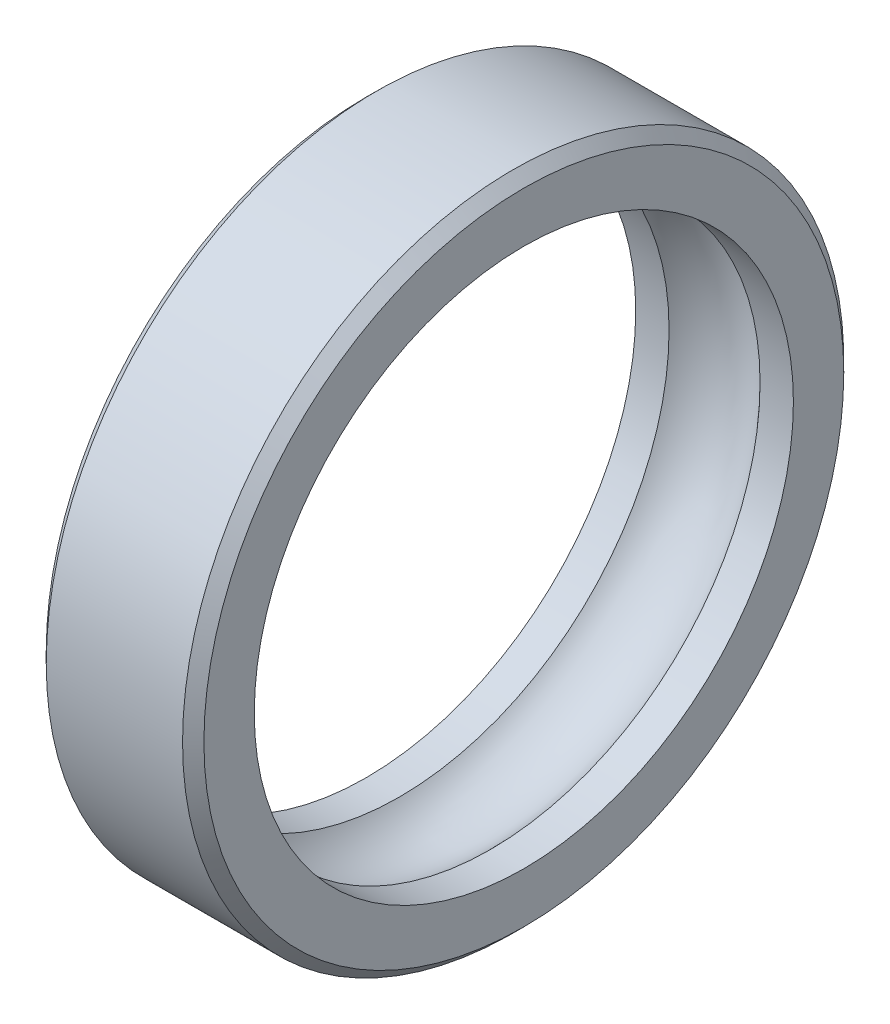
ISO-10303-21;
HEADER;
FILE_DESCRIPTION(('STEP AP214'),'2;1');
FILE_NAME('part.step','',(''),(''),'','','');
FILE_SCHEMA(('AUTOMOTIVE_DESIGN { 1 0 10303 214 1 1 1 1 }'));
ENDSEC;
DATA;
#1=APPLICATION_CONTEXT('core data for automotive mechanical design processes');
#2=APPLICATION_PROTOCOL_DEFINITION('international standard','automotive_design',2000,#1);
#3=PRODUCT_CONTEXT('',#1,'mechanical');
#4=PRODUCT('Part','Part','',(#3));
#5=PRODUCT_RELATED_PRODUCT_CATEGORY('part','',(#4));
#6=PRODUCT_DEFINITION_FORMATION('','',#4);
#7=PRODUCT_DEFINITION_CONTEXT('part definition',#1,'design');
#8=PRODUCT_DEFINITION('design','',#6,#7);
#9=PRODUCT_DEFINITION_SHAPE('','',#8);
#10=(LENGTH_UNIT() NAMED_UNIT(*) SI_UNIT(.MILLI.,.METRE.));
#11=(NAMED_UNIT(*) PLANE_ANGLE_UNIT() SI_UNIT($,.RADIAN.));
#12=(NAMED_UNIT(*) SI_UNIT($,.STERADIAN.) SOLID_ANGLE_UNIT());
#13=UNCERTAINTY_MEASURE_WITH_UNIT(LENGTH_MEASURE(1.E-05),#10,'distance_accuracy_value','');
#14=(GEOMETRIC_REPRESENTATION_CONTEXT(3) GLOBAL_UNCERTAINTY_ASSIGNED_CONTEXT((#13)) GLOBAL_UNIT_ASSIGNED_CONTEXT((#10,
#11,#12)) REPRESENTATION_CONTEXT('',''));
#15=CARTESIAN_POINT('',(0.,0.,0.));
#16=DIRECTION('',(0.,0.,1.));
#17=DIRECTION('',(1.,0.,0.));
#18=AXIS2_PLACEMENT_3D('',#15,#16,#17);
#19=CARTESIAN_POINT('',(-15.0200688073395,0.,0.));
#20=DIRECTION('',(-1.,0.,0.));
#21=DIRECTION('',(0.,0.,1.));
#22=AXIS2_PLACEMENT_3D('',#19,#20,#21);
#23=CYLINDRICAL_SURFACE('',#22,53.);
#24=CARTESIAN_POINT('',(15.5,0.,0.));
#25=DIRECTION('',(-1.,0.,0.));
#26=DIRECTION('',(0.,0.,1.));
#27=AXIS2_PLACEMENT_3D('',#24,#25,#26);
#28=CIRCLE('',#27,53.);
#29=CARTESIAN_POINT('',(15.5,0.,53.));
#30=VERTEX_POINT('',#29);
#31=EDGE_CURVE('E64',#30,#30,#28,.T.);
#32=ORIENTED_EDGE('',*,*,#31,.F.);
#33=EDGE_LOOP('',(#32));
#34=FACE_BOUND('',#33,.T.);
#35=CARTESIAN_POINT('',(8.94427190999916,0.,0.));
#36=DIRECTION('',(-1.,0.,0.));
#37=DIRECTION('',(0.,0.,1.));
#38=AXIS2_PLACEMENT_3D('',#35,#36,#37);
#39=CIRCLE('',#38,53.);
#40=CARTESIAN_POINT('',(8.94427190999916,0.,53.));
#41=VERTEX_POINT('',#40);
#42=EDGE_CURVE('E76',#41,#41,#39,.T.);
#43=ORIENTED_EDGE('',*,*,#42,.T.);
#44=EDGE_LOOP('',(#43));
#45=FACE_BOUND('',#44,.T.);
#46=ADVANCED_FACE('F39',(#34,#45),#23,.F.);
#47=CARTESIAN_POINT('',(15.5,65.,0.));
#48=DIRECTION('',(-1.,0.,0.));
#49=DIRECTION('',(0.,0.,1.));
#50=AXIS2_PLACEMENT_3D('',#47,#48,#49);
#51=PLANE('',#50);
#52=CARTESIAN_POINT('',(15.5,0.,0.));
#53=DIRECTION('',(-1.,0.,0.));
#54=DIRECTION('',(0.,0.,1.));
#55=AXIS2_PLACEMENT_3D('',#52,#53,#54);
#56=CIRCLE('',#55,62.9);
#57=CARTESIAN_POINT('',(15.5,0.,62.9));
#58=VERTEX_POINT('',#57);
#59=EDGE_CURVE('E48',#58,#58,#56,.F.);
#60=ORIENTED_EDGE('',*,*,#59,.T.);
#61=EDGE_LOOP('',(#60));
#62=FACE_BOUND('',#61,.T.);
#63=ORIENTED_EDGE('',*,*,#31,.T.);
#64=EDGE_LOOP('',(#63));
#65=FACE_BOUND('',#64,.T.);
#66=ADVANCED_FACE('F102',(#62,#65),#51,.F.);
#67=CARTESIAN_POINT('',(-15.0200688073395,0.,0.));
#68=DIRECTION('',(-1.,0.,0.));
#69=DIRECTION('',(0.,0.,1.));
#70=AXIS2_PLACEMENT_3D('',#67,#68,#69);
#71=CYLINDRICAL_SURFACE('',#70,65.);
#72=CARTESIAN_POINT('',(13.4,0.,0.));
#73=DIRECTION('',(-1.,0.,0.));
#74=DIRECTION('',(0.,0.,1.));
#75=AXIS2_PLACEMENT_3D('',#72,#73,#74);
#76=CIRCLE('',#75,65.);
#77=CARTESIAN_POINT('',(13.4,0.,65.));
#78=VERTEX_POINT('',#77);
#79=EDGE_CURVE('E53',#78,#78,#76,.T.);
#80=ORIENTED_EDGE('',*,*,#79,.T.);
#81=EDGE_LOOP('',(#80));
#82=FACE_BOUND('',#81,.T.);
#83=CARTESIAN_POINT('',(-13.4000000000001,0.,0.));
#84=DIRECTION('',(1.,0.,0.));
#85=DIRECTION('',(0.,0.,-1.));
#86=AXIS2_PLACEMENT_3D('',#83,#84,#85);
#87=CIRCLE('',#86,65.);
#88=CARTESIAN_POINT('',(-13.4000000000001,0.,-65.));
#89=VERTEX_POINT('',#88);
#90=EDGE_CURVE('E58',#89,#89,#87,.T.);
#91=ORIENTED_EDGE('',*,*,#90,.T.);
#92=EDGE_LOOP('',(#91));
#93=FACE_BOUND('',#92,.T.);
#94=ADVANCED_FACE('F97',(#82,#93),#71,.T.);
#95=CARTESIAN_POINT('',(-15.5,65.,0.));
#96=DIRECTION('',(1.,0.,0.));
#97=DIRECTION('',(0.,0.,-1.));
#98=AXIS2_PLACEMENT_3D('',#95,#96,#97);
#99=PLANE('',#98);
#100=CARTESIAN_POINT('',(-15.5,0.,0.));
#101=DIRECTION('',(1.,0.,0.));
#102=DIRECTION('',(0.,0.,-1.));
#103=AXIS2_PLACEMENT_3D('',#100,#101,#102);
#104=CIRCLE('',#103,62.9000000000001);
#105=CARTESIAN_POINT('',(-15.5,0.,-62.9000000000001));
#106=VERTEX_POINT('',#105);
#107=EDGE_CURVE('E10',#106,#106,#104,.F.);
#108=ORIENTED_EDGE('',*,*,#107,.T.);
#109=EDGE_LOOP('',(#108));
#110=FACE_BOUND('',#109,.T.);
#111=CARTESIAN_POINT('',(-15.5,0.,0.));
#112=DIRECTION('',(-1.,0.,0.));
#113=DIRECTION('',(0.,0.,1.));
#114=AXIS2_PLACEMENT_3D('',#111,#112,#113);
#115=CIRCLE('',#114,53.);
#116=CARTESIAN_POINT('',(-15.5,0.,53.));
#117=VERTEX_POINT('',#116);
#118=EDGE_CURVE('E68',#117,#117,#115,.T.);
#119=ORIENTED_EDGE('',*,*,#118,.F.);
#120=EDGE_LOOP('',(#119));
#121=FACE_BOUND('',#120,.T.);
#122=ADVANCED_FACE('F92',(#110,#121),#99,.F.);
#123=CARTESIAN_POINT('',(-15.0200688073395,0.,0.));
#124=DIRECTION('',(-1.,0.,0.));
#125=DIRECTION('',(0.,0.,1.));
#126=AXIS2_PLACEMENT_3D('',#123,#124,#125);
#127=CYLINDRICAL_SURFACE('',#126,53.);
#128=CARTESIAN_POINT('',(-8.94427190999916,0.,0.));
#129=DIRECTION('',(-1.,0.,0.));
#130=DIRECTION('',(0.,0.,1.));
#131=AXIS2_PLACEMENT_3D('',#128,#129,#130);
#132=CIRCLE('',#131,53.);
#133=CARTESIAN_POINT('',(-8.94427190999916,0.,53.));
#134=VERTEX_POINT('',#133);
#135=EDGE_CURVE('E72',#134,#134,#132,.T.);
#136=ORIENTED_EDGE('',*,*,#135,.F.);
#137=EDGE_LOOP('',(#136));
#138=FACE_BOUND('',#137,.T.);
#139=ORIENTED_EDGE('',*,*,#118,.T.);
#140=EDGE_LOOP('',(#139));
#141=FACE_BOUND('',#140,.T.);
#142=ADVANCED_FACE('F86',(#138,#141),#127,.F.);
#143=CARTESIAN_POINT('',(0.,0.,0.));
#144=DIRECTION('',(-1.,0.,0.));
#145=DIRECTION('',(0.,0.,1.));
#146=AXIS2_PLACEMENT_3D('',#143,#144,#145);
#147=TOROIDAL_SURFACE('',#146,45.,12.);
#148=ORIENTED_EDGE('',*,*,#42,.F.);
#149=EDGE_LOOP('',(#148));
#150=FACE_BOUND('',#149,.T.);
#151=ORIENTED_EDGE('',*,*,#135,.T.);
#152=EDGE_LOOP('',(#151));
#153=FACE_BOUND('',#152,.T.);
#154=ADVANCED_FACE('F82',(#150,#153),#147,.F.);
#155=CARTESIAN_POINT('',(13.4,0.,0.));
#156=DIRECTION('',(-1.,0.,0.));
#157=DIRECTION('',(0.,0.,1.));
#158=AXIS2_PLACEMENT_3D('',#155,#156,#157);
#159=CONICAL_SURFACE('',#158,65.,0.785398163397448);
#160=ORIENTED_EDGE('',*,*,#59,.F.);
#161=EDGE_LOOP('',(#160));
#162=FACE_BOUND('',#161,.T.);
#163=ORIENTED_EDGE('',*,*,#79,.F.);
#164=EDGE_LOOP('',(#163));
#165=FACE_BOUND('',#164,.T.);
#166=ADVANCED_FACE('F85',(#162,#165),#159,.T.);
#167=CARTESIAN_POINT('',(-15.5,0.,0.));
#168=DIRECTION('',(1.,0.,0.));
#169=DIRECTION('',(0.,0.,-1.));
#170=AXIS2_PLACEMENT_3D('',#167,#168,#169);
#171=CONICAL_SURFACE('',#170,62.9000000000001,0.785398163397445);
#172=ORIENTED_EDGE('',*,*,#90,.F.);
#173=EDGE_LOOP('',(#172));
#174=FACE_BOUND('',#173,.T.);
#175=ORIENTED_EDGE('',*,*,#107,.F.);
#176=EDGE_LOOP('',(#175));
#177=FACE_BOUND('',#176,.T.);
#178=ADVANCED_FACE('F42',(#174,#177),#171,.T.);
#179=CLOSED_SHELL('',(#46,#66,#94,#122,#142,#154,#166,#178));
#180=MANIFOLD_SOLID_BREP('B2',#179);
#181=ADVANCED_BREP_SHAPE_REPRESENTATION('',(#18,#180),#14);
#182=SHAPE_DEFINITION_REPRESENTATION(#9,#181);
ENDSEC;
END-ISO-10303-21;
